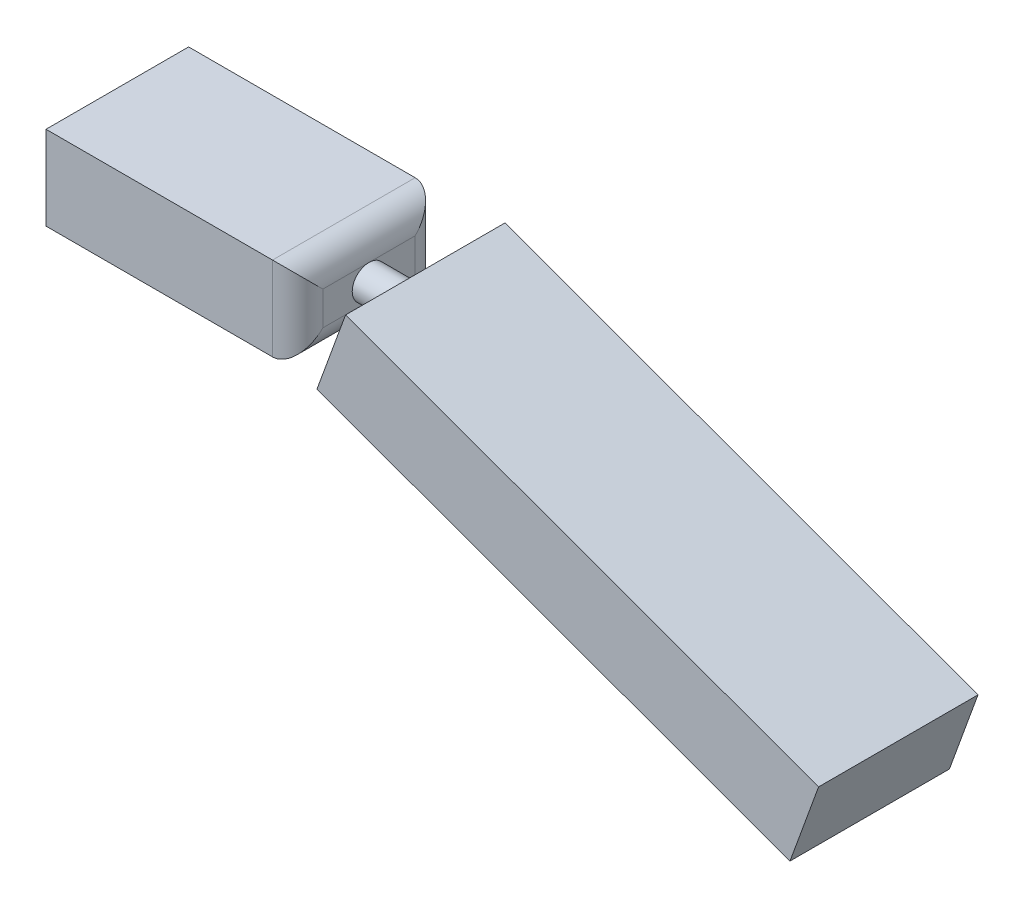
ISO-10303-21;
HEADER;
FILE_DESCRIPTION(('STEP AP214'),'2;1');
FILE_NAME('part.step','',(''),(''),'','','');
FILE_SCHEMA(('AUTOMOTIVE_DESIGN { 1 0 10303 214 1 1 1 1 }'));
ENDSEC;
DATA;
#1=APPLICATION_CONTEXT('core data for automotive mechanical design processes');
#2=APPLICATION_PROTOCOL_DEFINITION('international standard','automotive_design',2000,#1);
#3=PRODUCT_CONTEXT('',#1,'mechanical');
#4=PRODUCT('Part','Part','',(#3));
#5=PRODUCT_RELATED_PRODUCT_CATEGORY('part','',(#4));
#6=PRODUCT_DEFINITION_FORMATION('','',#4);
#7=PRODUCT_DEFINITION_CONTEXT('part definition',#1,'design');
#8=PRODUCT_DEFINITION('design','',#6,#7);
#9=PRODUCT_DEFINITION_SHAPE('','',#8);
#10=(LENGTH_UNIT() NAMED_UNIT(*) SI_UNIT(.MILLI.,.METRE.));
#11=(NAMED_UNIT(*) PLANE_ANGLE_UNIT() SI_UNIT($,.RADIAN.));
#12=(NAMED_UNIT(*) SI_UNIT($,.STERADIAN.) SOLID_ANGLE_UNIT());
#13=UNCERTAINTY_MEASURE_WITH_UNIT(LENGTH_MEASURE(1.E-05),#10,'distance_accuracy_value','');
#14=(GEOMETRIC_REPRESENTATION_CONTEXT(3) GLOBAL_UNCERTAINTY_ASSIGNED_CONTEXT((#13)) GLOBAL_UNIT_ASSIGNED_CONTEXT((#10,
#11,#12)) REPRESENTATION_CONTEXT('',''));
#15=CARTESIAN_POINT('',(0.,0.,0.));
#16=DIRECTION('',(0.,0.,1.));
#17=DIRECTION('',(1.,0.,0.));
#18=AXIS2_PLACEMENT_3D('',#15,#16,#17);
#19=CARTESIAN_POINT('',(35.,5.,-8.5));
#20=DIRECTION('',(-1.,0.,0.));
#21=DIRECTION('',(0.,0.,1.));
#22=AXIS2_PLACEMENT_3D('',#19,#20,#21);
#23=CYLINDRICAL_SURFACE('',#22,2.);
#24=CARTESIAN_POINT('',(30.,5.,-8.5));
#25=DIRECTION('',(1.,0.,0.));
#26=DIRECTION('',(0.,0.,-1.));
#27=AXIS2_PLACEMENT_3D('',#24,#25,#26);
#28=CIRCLE('',#27,2.);
#29=CARTESIAN_POINT('',(30.,7.,-8.5));
#30=VERTEX_POINT('',#29);
#31=CARTESIAN_POINT('',(30.,3.,-8.5));
#32=VERTEX_POINT('',#31);
#33=EDGE_CURVE('E56',#30,#32,#28,.T.);
#34=ORIENTED_EDGE('',*,*,#33,.T.);
#35=EDGE_CURVE('E189',#32,#30,#28,.T.);
#36=ORIENTED_EDGE('',*,*,#35,.T.);
#37=EDGE_LOOP('',(#34,#36));
#38=FACE_BOUND('',#37,.T.);
#39=CARTESIAN_POINT('',(35.,5.,-8.5));
#40=DIRECTION('',(0.939692620785911,-0.342020143325663,0.));
#41=DIRECTION('',(-0.342020143325663,-0.939692620785911,0.));
#42=AXIS2_PLACEMENT_3D('',#39,#40,#41);
#43=ELLIPSE('',#42,2.12835554495182,2.);
#44=CARTESIAN_POINT('',(35.,5.,-6.5));
#45=VERTEX_POINT('',#44);
#46=CARTESIAN_POINT('',(35.,5.,-10.5));
#47=VERTEX_POINT('',#46);
#48=EDGE_CURVE('E49',#45,#47,#43,.T.);
#49=ORIENTED_EDGE('',*,*,#48,.F.);
#50=CARTESIAN_POINT('',(35.,5.,-8.5));
#51=DIRECTION('',(1.,0.,0.));
#52=DIRECTION('',(0.,0.,-1.));
#53=AXIS2_PLACEMENT_3D('',#50,#51,#52);
#54=CIRCLE('',#53,2.);
#55=EDGE_CURVE('E190',#47,#45,#54,.T.);
#56=ORIENTED_EDGE('',*,*,#55,.F.);
#57=EDGE_LOOP('',(#49,#56));
#58=FACE_BOUND('',#57,.T.);
#59=ADVANCED_FACE('F35',(#38,#58),#23,.T.);
#60=CARTESIAN_POINT('',(35.,5.,-8.5));
#61=DIRECTION('',(1.,0.,0.));
#62=DIRECTION('',(0.,0.,-1.));
#63=AXIS2_PLACEMENT_3D('',#60,#61,#62);
#64=PLANE('',#63);
#65=ORIENTED_EDGE('',*,*,#55,.T.);
#66=DIRECTION('',(0.,0.,-1.));
#67=VECTOR('',#66,1.);
#68=CARTESIAN_POINT('',(35.,5.,-8.5));
#69=LINE('',#68,#67);
#70=EDGE_CURVE('E11',#45,#47,#69,.T.);
#71=ORIENTED_EDGE('',*,*,#70,.T.);
#72=EDGE_LOOP('',(#65,#71));
#73=FACE_BOUND('',#72,.T.);
#74=ADVANCED_FACE('F320',(#73),#64,.T.);
#75=CARTESIAN_POINT('',(30.,10.,0.));
#76=DIRECTION('',(-1.,0.,0.));
#77=DIRECTION('',(0.,0.,1.));
#78=AXIS2_PLACEMENT_3D('',#75,#76,#77);
#79=PLANE('',#78);
#80=ORIENTED_EDGE('',*,*,#35,.F.);
#81=DIRECTION('',(0.,0.,-1.));
#82=VECTOR('',#81,1.);
#83=CARTESIAN_POINT('',(30.,3.,-17.));
#84=LINE('',#83,#82);
#85=CARTESIAN_POINT('',(30.,3.,-14.));
#86=VERTEX_POINT('',#85);
#87=EDGE_CURVE('E250',#32,#86,#84,.T.);
#88=ORIENTED_EDGE('',*,*,#87,.T.);
#89=DIRECTION('',(0.,-1.,0.));
#90=VECTOR('',#89,1.);
#91=CARTESIAN_POINT('',(30.,10.,-14.));
#92=LINE('',#91,#90);
#93=CARTESIAN_POINT('',(30.,7.,-14.));
#94=VERTEX_POINT('',#93);
#95=EDGE_CURVE('E253',#86,#94,#92,.F.);
#96=ORIENTED_EDGE('',*,*,#95,.T.);
#97=DIRECTION('',(0.,0.,-1.));
#98=VECTOR('',#97,1.);
#99=CARTESIAN_POINT('',(30.,7.,0.));
#100=LINE('',#99,#98);
#101=EDGE_CURVE('E256',#94,#30,#100,.F.);
#102=ORIENTED_EDGE('',*,*,#101,.T.);
#103=EDGE_LOOP('',(#80,#88,#96,#102));
#104=FACE_BOUND('',#103,.T.);
#105=ADVANCED_FACE('F316',(#104),#79,.F.);
#106=CARTESIAN_POINT('',(0.,10.,0.));
#107=DIRECTION('',(1.,0.,0.));
#108=DIRECTION('',(0.,0.,-1.));
#109=AXIS2_PLACEMENT_3D('',#106,#107,#108);
#110=PLANE('',#109);
#111=DIRECTION('',(0.,-1.,0.));
#112=VECTOR('',#111,1.);
#113=CARTESIAN_POINT('',(0.,1.5,-15.5));
#114=LINE('',#113,#112);
#115=CARTESIAN_POINT('',(0.,8.5,-15.5));
#116=VERTEX_POINT('',#115);
#117=CARTESIAN_POINT('',(0.,1.5,-15.5));
#118=VERTEX_POINT('',#117);
#119=EDGE_CURVE('E211',#116,#118,#114,.T.);
#120=ORIENTED_EDGE('',*,*,#119,.F.);
#121=DIRECTION('',(0.,0.,-1.));
#122=VECTOR('',#121,1.);
#123=CARTESIAN_POINT('',(0.,8.5,-15.5));
#124=LINE('',#123,#122);
#125=CARTESIAN_POINT('',(0.,8.5,-1.5));
#126=VERTEX_POINT('',#125);
#127=EDGE_CURVE('E209',#126,#116,#124,.T.);
#128=ORIENTED_EDGE('',*,*,#127,.F.);
#129=DIRECTION('',(0.,1.,0.));
#130=VECTOR('',#129,1.);
#131=CARTESIAN_POINT('',(0.,8.5,-1.5));
#132=LINE('',#131,#130);
#133=CARTESIAN_POINT('',(0.,1.5,-1.5));
#134=VERTEX_POINT('',#133);
#135=EDGE_CURVE('E199',#134,#126,#132,.T.);
#136=ORIENTED_EDGE('',*,*,#135,.F.);
#137=DIRECTION('',(0.,0.,1.));
#138=VECTOR('',#137,1.);
#139=CARTESIAN_POINT('',(0.,1.5,-15.5));
#140=LINE('',#139,#138);
#141=EDGE_CURVE('E215',#118,#134,#140,.T.);
#142=ORIENTED_EDGE('',*,*,#141,.F.);
#143=EDGE_LOOP('',(#120,#128,#136,#142));
#144=FACE_BOUND('',#143,.T.);
#145=DIRECTION('',(0.,0.,1.));
#146=VECTOR('',#145,1.);
#147=CARTESIAN_POINT('',(0.,0.,0.));
#148=LINE('',#147,#146);
#149=CARTESIAN_POINT('',(0.,0.,-17.));
#150=VERTEX_POINT('',#149);
#151=CARTESIAN_POINT('',(0.,0.,0.));
#152=VERTEX_POINT('',#151);
#153=EDGE_CURVE('E222',#150,#152,#148,.T.);
#154=ORIENTED_EDGE('',*,*,#153,.T.);
#155=DIRECTION('',(0.,-1.,0.));
#156=VECTOR('',#155,1.);
#157=CARTESIAN_POINT('',(0.,10.,0.));
#158=LINE('',#157,#156);
#159=CARTESIAN_POINT('',(0.,10.,0.));
#160=VERTEX_POINT('',#159);
#161=EDGE_CURVE('E247',#160,#152,#158,.T.);
#162=ORIENTED_EDGE('',*,*,#161,.F.);
#163=DIRECTION('',(0.,0.,1.));
#164=VECTOR('',#163,1.);
#165=CARTESIAN_POINT('',(0.,10.,0.));
#166=LINE('',#165,#164);
#167=CARTESIAN_POINT('',(0.,10.,-17.));
#168=VERTEX_POINT('',#167);
#169=EDGE_CURVE('E229',#168,#160,#166,.T.);
#170=ORIENTED_EDGE('',*,*,#169,.F.);
#171=DIRECTION('',(0.,-1.,0.));
#172=VECTOR('',#171,1.);
#173=CARTESIAN_POINT('',(0.,10.,-17.));
#174=LINE('',#173,#172);
#175=EDGE_CURVE('E238',#168,#150,#174,.T.);
#176=ORIENTED_EDGE('',*,*,#175,.T.);
#177=EDGE_LOOP('',(#154,#162,#170,#176));
#178=FACE_BOUND('',#177,.T.);
#179=ADVANCED_FACE('F297',(#144,#178),#110,.F.);
#180=CARTESIAN_POINT('',(0.,10.,0.));
#181=DIRECTION('',(0.,0.,-1.));
#182=DIRECTION('',(-1.,0.,0.));
#183=AXIS2_PLACEMENT_3D('',#180,#181,#182);
#184=PLANE('',#183);
#185=DIRECTION('',(1.,0.,0.));
#186=VECTOR('',#185,1.);
#187=CARTESIAN_POINT('',(0.,0.,0.));
#188=LINE('',#187,#186);
#189=CARTESIAN_POINT('',(27.,0.,0.));
#190=VERTEX_POINT('',#189);
#191=EDGE_CURVE('E241',#152,#190,#188,.T.);
#192=ORIENTED_EDGE('',*,*,#191,.T.);
#193=DIRECTION('',(0.,-1.,0.));
#194=VECTOR('',#193,1.);
#195=CARTESIAN_POINT('',(27.,10.,0.));
#196=LINE('',#195,#194);
#197=CARTESIAN_POINT('',(27.,10.,0.));
#198=VERTEX_POINT('',#197);
#199=EDGE_CURVE('E262',#190,#198,#196,.F.);
#200=ORIENTED_EDGE('',*,*,#199,.T.);
#201=DIRECTION('',(1.,0.,0.));
#202=VECTOR('',#201,1.);
#203=CARTESIAN_POINT('',(0.,10.,0.));
#204=LINE('',#203,#202);
#205=EDGE_CURVE('E232',#160,#198,#204,.T.);
#206=ORIENTED_EDGE('',*,*,#205,.F.);
#207=ORIENTED_EDGE('',*,*,#161,.T.);
#208=EDGE_LOOP('',(#192,#200,#206,#207));
#209=FACE_BOUND('',#208,.T.);
#210=ADVANCED_FACE('F302',(#209),#184,.F.);
#211=ORIENTED_EDGE('',*,*,#33,.F.);
#212=CARTESIAN_POINT('',(30.,7.,-3.));
#213=VERTEX_POINT('',#212);
#214=EDGE_CURVE('E255',#30,#213,#100,.F.);
#215=ORIENTED_EDGE('',*,*,#214,.T.);
#216=DIRECTION('',(0.,-1.,0.));
#217=VECTOR('',#216,1.);
#218=CARTESIAN_POINT('',(30.,10.,-3.));
#219=LINE('',#218,#217);
#220=CARTESIAN_POINT('',(30.,3.,-3.));
#221=VERTEX_POINT('',#220);
#222=EDGE_CURVE('E259',#213,#221,#219,.T.);
#223=ORIENTED_EDGE('',*,*,#222,.T.);
#224=EDGE_CURVE('E251',#221,#32,#84,.T.);
#225=ORIENTED_EDGE('',*,*,#224,.T.);
#226=EDGE_LOOP('',(#211,#215,#223,#225));
#227=FACE_BOUND('',#226,.T.);
#228=ADVANCED_FACE('F313',(#227),#79,.F.);
#229=CARTESIAN_POINT('',(0.,10.,-17.));
#230=DIRECTION('',(0.,0.,1.));
#231=DIRECTION('',(1.,0.,0.));
#232=AXIS2_PLACEMENT_3D('',#229,#230,#231);
#233=PLANE('',#232);
#234=DIRECTION('',(-1.,0.,0.));
#235=VECTOR('',#234,1.);
#236=CARTESIAN_POINT('',(0.,10.,-17.));
#237=LINE('',#236,#235);
#238=CARTESIAN_POINT('',(27.,10.,-17.));
#239=VERTEX_POINT('',#238);
#240=EDGE_CURVE('E236',#239,#168,#237,.T.);
#241=ORIENTED_EDGE('',*,*,#240,.F.);
#242=DIRECTION('',(0.,-1.,0.));
#243=VECTOR('',#242,1.);
#244=CARTESIAN_POINT('',(27.,10.,-17.));
#245=LINE('',#244,#243);
#246=CARTESIAN_POINT('',(27.,0.,-17.));
#247=VERTEX_POINT('',#246);
#248=EDGE_CURVE('E267',#239,#247,#245,.T.);
#249=ORIENTED_EDGE('',*,*,#248,.T.);
#250=DIRECTION('',(-1.,0.,0.));
#251=VECTOR('',#250,1.);
#252=CARTESIAN_POINT('',(0.,0.,-17.));
#253=LINE('',#252,#251);
#254=EDGE_CURVE('E233',#247,#150,#253,.T.);
#255=ORIENTED_EDGE('',*,*,#254,.T.);
#256=ORIENTED_EDGE('',*,*,#175,.F.);
#257=EDGE_LOOP('',(#241,#249,#255,#256));
#258=FACE_BOUND('',#257,.T.);
#259=ADVANCED_FACE('F290',(#258),#233,.F.);
#260=CARTESIAN_POINT('',(0.,10.,0.));
#261=DIRECTION('',(0.,-1.,0.));
#262=DIRECTION('',(0.,0.,-1.));
#263=AXIS2_PLACEMENT_3D('',#260,#261,#262);
#264=PLANE('',#263);
#265=ORIENTED_EDGE('',*,*,#205,.T.);
#266=DIRECTION('',(0.,0.,-1.));
#267=VECTOR('',#266,1.);
#268=CARTESIAN_POINT('',(27.,10.,0.));
#269=LINE('',#268,#267);
#270=EDGE_CURVE('E265',#198,#239,#269,.T.);
#271=ORIENTED_EDGE('',*,*,#270,.T.);
#272=ORIENTED_EDGE('',*,*,#240,.T.);
#273=ORIENTED_EDGE('',*,*,#169,.T.);
#274=EDGE_LOOP('',(#265,#271,#272,#273));
#275=FACE_BOUND('',#274,.T.);
#276=ADVANCED_FACE('F300',(#275),#264,.F.);
#277=CARTESIAN_POINT('',(0.,0.,0.));
#278=DIRECTION('',(0.,-1.,0.));
#279=DIRECTION('',(0.,0.,-1.));
#280=AXIS2_PLACEMENT_3D('',#277,#278,#279);
#281=PLANE('',#280);
#282=ORIENTED_EDGE('',*,*,#254,.F.);
#283=DIRECTION('',(0.,0.,-1.));
#284=VECTOR('',#283,1.);
#285=CARTESIAN_POINT('',(27.,0.,0.));
#286=LINE('',#285,#284);
#287=EDGE_CURVE('E43',#247,#190,#286,.F.);
#288=ORIENTED_EDGE('',*,*,#287,.T.);
#289=ORIENTED_EDGE('',*,*,#191,.F.);
#290=ORIENTED_EDGE('',*,*,#153,.F.);
#291=EDGE_LOOP('',(#282,#288,#289,#290));
#292=FACE_BOUND('',#291,.T.);
#293=ADVANCED_FACE('F294',(#292),#281,.T.);
#294=CARTESIAN_POINT('',(12.,8.5,-15.5));
#295=DIRECTION('',(0.,1.,0.));
#296=DIRECTION('',(0.,0.,1.));
#297=AXIS2_PLACEMENT_3D('',#294,#295,#296);
#298=PLANE('',#297);
#299=ORIENTED_EDGE('',*,*,#127,.T.);
#300=DIRECTION('',(-1.,0.,0.));
#301=VECTOR('',#300,1.);
#302=CARTESIAN_POINT('',(12.,8.5,-15.5));
#303=LINE('',#302,#301);
#304=CARTESIAN_POINT('',(12.,8.5,-15.5));
#305=VERTEX_POINT('',#304);
#306=EDGE_CURVE('E208',#305,#116,#303,.T.);
#307=ORIENTED_EDGE('',*,*,#306,.F.);
#308=DIRECTION('',(0.,0.,-1.));
#309=VECTOR('',#308,1.);
#310=CARTESIAN_POINT('',(12.,8.5,-15.5));
#311=LINE('',#310,#309);
#312=CARTESIAN_POINT('',(12.,8.5,-1.5));
#313=VERTEX_POINT('',#312);
#314=EDGE_CURVE('E195',#313,#305,#311,.T.);
#315=ORIENTED_EDGE('',*,*,#314,.F.);
#316=DIRECTION('',(-1.,0.,0.));
#317=VECTOR('',#316,1.);
#318=CARTESIAN_POINT('',(12.,8.5,-1.5));
#319=LINE('',#318,#317);
#320=EDGE_CURVE('E220',#313,#126,#319,.T.);
#321=ORIENTED_EDGE('',*,*,#320,.T.);
#322=EDGE_LOOP('',(#299,#307,#315,#321));
#323=FACE_BOUND('',#322,.T.);
#324=ADVANCED_FACE('F355',(#323),#298,.F.);
#325=CARTESIAN_POINT('',(12.,8.5,-1.5));
#326=DIRECTION('',(0.,0.,1.));
#327=DIRECTION('',(1.,0.,0.));
#328=AXIS2_PLACEMENT_3D('',#325,#326,#327);
#329=PLANE('',#328);
#330=ORIENTED_EDGE('',*,*,#135,.T.);
#331=ORIENTED_EDGE('',*,*,#320,.F.);
#332=DIRECTION('',(0.,1.,0.));
#333=VECTOR('',#332,1.);
#334=CARTESIAN_POINT('',(12.,8.5,-1.5));
#335=LINE('',#334,#333);
#336=CARTESIAN_POINT('',(12.,1.5,-1.5));
#337=VERTEX_POINT('',#336);
#338=EDGE_CURVE('E205',#337,#313,#335,.T.);
#339=ORIENTED_EDGE('',*,*,#338,.F.);
#340=DIRECTION('',(-1.,0.,0.));
#341=VECTOR('',#340,1.);
#342=CARTESIAN_POINT('',(12.,1.5,-1.5));
#343=LINE('',#342,#341);
#344=EDGE_CURVE('E223',#337,#134,#343,.T.);
#345=ORIENTED_EDGE('',*,*,#344,.T.);
#346=EDGE_LOOP('',(#330,#331,#339,#345));
#347=FACE_BOUND('',#346,.T.);
#348=ADVANCED_FACE('F351',(#347),#329,.F.);
#349=CARTESIAN_POINT('',(12.,1.5,-15.5));
#350=DIRECTION('',(0.,-1.,0.));
#351=DIRECTION('',(0.,0.,-1.));
#352=AXIS2_PLACEMENT_3D('',#349,#350,#351);
#353=PLANE('',#352);
#354=ORIENTED_EDGE('',*,*,#141,.T.);
#355=ORIENTED_EDGE('',*,*,#344,.F.);
#356=DIRECTION('',(0.,0.,1.));
#357=VECTOR('',#356,1.);
#358=CARTESIAN_POINT('',(12.,1.5,-15.5));
#359=LINE('',#358,#357);
#360=CARTESIAN_POINT('',(12.,1.5,-15.5));
#361=VERTEX_POINT('',#360);
#362=EDGE_CURVE('E202',#361,#337,#359,.T.);
#363=ORIENTED_EDGE('',*,*,#362,.F.);
#364=DIRECTION('',(-1.,0.,0.));
#365=VECTOR('',#364,1.);
#366=CARTESIAN_POINT('',(12.,1.5,-15.5));
#367=LINE('',#366,#365);
#368=EDGE_CURVE('E225',#361,#118,#367,.T.);
#369=ORIENTED_EDGE('',*,*,#368,.T.);
#370=EDGE_LOOP('',(#354,#355,#363,#369));
#371=FACE_BOUND('',#370,.T.);
#372=ADVANCED_FACE('F354',(#371),#353,.F.);
#373=CARTESIAN_POINT('',(12.,1.5,-15.5));
#374=DIRECTION('',(0.,0.,-1.));
#375=DIRECTION('',(-1.,0.,0.));
#376=AXIS2_PLACEMENT_3D('',#373,#374,#375);
#377=PLANE('',#376);
#378=ORIENTED_EDGE('',*,*,#119,.T.);
#379=ORIENTED_EDGE('',*,*,#368,.F.);
#380=DIRECTION('',(0.,-1.,0.));
#381=VECTOR('',#380,1.);
#382=CARTESIAN_POINT('',(12.,1.5,-15.5));
#383=LINE('',#382,#381);
#384=EDGE_CURVE('E198',#305,#361,#383,.T.);
#385=ORIENTED_EDGE('',*,*,#384,.F.);
#386=ORIENTED_EDGE('',*,*,#306,.T.);
#387=EDGE_LOOP('',(#378,#379,#385,#386));
#388=FACE_BOUND('',#387,.T.);
#389=ADVANCED_FACE('F349',(#388),#377,.F.);
#390=CARTESIAN_POINT('',(12.,0.,0.));
#391=DIRECTION('',(1.,0.,0.));
#392=DIRECTION('',(0.,0.,-1.));
#393=AXIS2_PLACEMENT_3D('',#390,#391,#392);
#394=PLANE('',#393);
#395=ORIENTED_EDGE('',*,*,#314,.T.);
#396=ORIENTED_EDGE('',*,*,#384,.T.);
#397=ORIENTED_EDGE('',*,*,#362,.T.);
#398=ORIENTED_EDGE('',*,*,#338,.T.);
#399=EDGE_LOOP('',(#395,#396,#397,#398));
#400=FACE_BOUND('',#399,.T.);
#401=ADVANCED_FACE('F346',(#400),#394,.F.);
#402=CARTESIAN_POINT('',(27.,10.,-14.));
#403=DIRECTION('',(0.,-1.,0.));
#404=DIRECTION('',(0.,0.,-1.));
#405=AXIS2_PLACEMENT_3D('',#402,#403,#404);
#406=CYLINDRICAL_SURFACE('',#405,3.);
#407=CARTESIAN_POINT('',(27.,3.,-14.));
#408=DIRECTION('',(0.,-0.707106781186547,0.707106781186547));
#409=DIRECTION('',(0.,0.707106781186547,0.707106781186547));
#410=AXIS2_PLACEMENT_3D('',#407,#408,#409);
#411=ELLIPSE('',#410,4.24264068711928,3.);
#412=EDGE_CURVE('E273',#247,#86,#411,.T.);
#413=ORIENTED_EDGE('',*,*,#412,.F.);
#414=ORIENTED_EDGE('',*,*,#248,.F.);
#415=CARTESIAN_POINT('',(27.,7.,-14.));
#416=DIRECTION('',(0.,-0.707106781186547,-0.707106781186547));
#417=DIRECTION('',(0.,-0.707106781186547,0.707106781186547));
#418=AXIS2_PLACEMENT_3D('',#415,#416,#417);
#419=ELLIPSE('',#418,4.24264068711928,3.);
#420=EDGE_CURVE('E212',#94,#239,#419,.F.);
#421=ORIENTED_EDGE('',*,*,#420,.F.);
#422=ORIENTED_EDGE('',*,*,#95,.F.);
#423=EDGE_LOOP('',(#413,#414,#421,#422));
#424=FACE_BOUND('',#423,.T.);
#425=ADVANCED_FACE('F37',(#424),#406,.T.);
#426=CARTESIAN_POINT('',(27.,7.,0.));
#427=DIRECTION('',(0.,0.,-1.));
#428=DIRECTION('',(-1.,0.,0.));
#429=AXIS2_PLACEMENT_3D('',#426,#427,#428);
#430=CYLINDRICAL_SURFACE('',#429,3.);
#431=ORIENTED_EDGE('',*,*,#420,.T.);
#432=ORIENTED_EDGE('',*,*,#270,.F.);
#433=CARTESIAN_POINT('',(27.,7.,-3.));
#434=DIRECTION('',(0.,0.707106781186547,-0.707106781186547));
#435=DIRECTION('',(0.,-0.707106781186547,-0.707106781186547));
#436=AXIS2_PLACEMENT_3D('',#433,#434,#435);
#437=ELLIPSE('',#436,4.24264068711928,3.);
#438=EDGE_CURVE('E271',#213,#198,#437,.F.);
#439=ORIENTED_EDGE('',*,*,#438,.F.);
#440=ORIENTED_EDGE('',*,*,#214,.F.);
#441=ORIENTED_EDGE('',*,*,#101,.F.);
#442=EDGE_LOOP('',(#431,#432,#439,#440,#441));
#443=FACE_BOUND('',#442,.T.);
#444=ADVANCED_FACE('F280',(#443),#430,.T.);
#445=CARTESIAN_POINT('',(27.,3.,0.));
#446=DIRECTION('',(0.,0.,1.));
#447=DIRECTION('',(1.,0.,0.));
#448=AXIS2_PLACEMENT_3D('',#445,#446,#447);
#449=CYLINDRICAL_SURFACE('',#448,3.);
#450=ORIENTED_EDGE('',*,*,#412,.T.);
#451=ORIENTED_EDGE('',*,*,#87,.F.);
#452=ORIENTED_EDGE('',*,*,#224,.F.);
#453=CARTESIAN_POINT('',(27.,3.,-3.));
#454=DIRECTION('',(0.,0.707106781186547,0.707106781186547));
#455=DIRECTION('',(0.,-0.707106781186547,0.707106781186547));
#456=AXIS2_PLACEMENT_3D('',#453,#454,#455);
#457=ELLIPSE('',#456,4.24264068711928,3.);
#458=EDGE_CURVE('E193',#190,#221,#457,.T.);
#459=ORIENTED_EDGE('',*,*,#458,.F.);
#460=ORIENTED_EDGE('',*,*,#287,.F.);
#461=EDGE_LOOP('',(#450,#451,#452,#459,#460));
#462=FACE_BOUND('',#461,.T.);
#463=ADVANCED_FACE('F310',(#462),#449,.T.);
#464=CARTESIAN_POINT('',(27.,10.,-3.));
#465=DIRECTION('',(0.,-1.,0.));
#466=DIRECTION('',(0.,0.,-1.));
#467=AXIS2_PLACEMENT_3D('',#464,#465,#466);
#468=CYLINDRICAL_SURFACE('',#467,3.);
#469=ORIENTED_EDGE('',*,*,#438,.T.);
#470=ORIENTED_EDGE('',*,*,#199,.F.);
#471=ORIENTED_EDGE('',*,*,#458,.T.);
#472=ORIENTED_EDGE('',*,*,#222,.F.);
#473=EDGE_LOOP('',(#469,#470,#471,#472));
#474=FACE_BOUND('',#473,.T.);
#475=ADVANCED_FACE('F306',(#474),#468,.T.);
#476=CARTESIAN_POINT('',(36.7045308884095,9.68316012666826,1.));
#477=DIRECTION('',(0.939692620785911,-0.342020143325663,0.));
#478=DIRECTION('',(0.342020143325663,0.939692620785911,0.));
#479=AXIS2_PLACEMENT_3D('',#476,#477,#478);
#480=PLANE('',#479);
#481=DIRECTION('',(0.,0.,-1.));
#482=VECTOR('',#481,1.);
#483=CARTESIAN_POINT('',(36.7045308884095,9.68316012666826,1.));
#484=LINE('',#483,#482);
#485=CARTESIAN_POINT('',(36.7045308884095,9.68316012666826,1.));
#486=VERTEX_POINT('',#485);
#487=CARTESIAN_POINT('',(36.7045308884095,9.68316012666826,-18.));
#488=VERTEX_POINT('',#487);
#489=EDGE_CURVE('E185',#486,#488,#484,.T.);
#490=ORIENTED_EDGE('',*,*,#489,.T.);
#491=DIRECTION('',(-0.342020143325663,-0.939692620785911,0.));
#492=VECTOR('',#491,1.);
#493=CARTESIAN_POINT('',(36.7045308884095,9.68316012666826,-18.));
#494=LINE('',#493,#492);
#495=CARTESIAN_POINT('',(33.2954691115904,0.316839873331753,-18.));
#496=VERTEX_POINT('',#495);
#497=EDGE_CURVE('E175',#488,#496,#494,.T.);
#498=ORIENTED_EDGE('',*,*,#497,.T.);
#499=DIRECTION('',(0.,0.,-1.));
#500=VECTOR('',#499,1.);
#501=CARTESIAN_POINT('',(33.2954691115904,0.316839873331753,1.));
#502=LINE('',#501,#500);
#503=CARTESIAN_POINT('',(33.2954691115904,0.316839873331753,1.));
#504=VERTEX_POINT('',#503);
#505=EDGE_CURVE('E171',#504,#496,#502,.T.);
#506=ORIENTED_EDGE('',*,*,#505,.F.);
#507=DIRECTION('',(-0.342020143325663,-0.939692620785911,0.));
#508=VECTOR('',#507,1.);
#509=CARTESIAN_POINT('',(36.7045308884095,9.68316012666826,1.));
#510=LINE('',#509,#508);
#511=EDGE_CURVE('E182',#486,#504,#510,.T.);
#512=ORIENTED_EDGE('',*,*,#511,.F.);
#513=EDGE_LOOP('',(#490,#498,#506,#512));
#514=FACE_BOUND('',#513,.T.);
#515=ORIENTED_EDGE('',*,*,#70,.F.);
#516=ORIENTED_EDGE('',*,*,#48,.T.);
#517=EDGE_LOOP('',(#515,#516));
#518=FACE_BOUND('',#517,.T.);
#519=ADVANCED_FACE('F324',(#514,#518),#480,.F.);
#520=CARTESIAN_POINT('',(33.2954691115904,0.316839873331753,1.));
#521=DIRECTION('',(0.342020143325663,0.939692620785911,0.));
#522=DIRECTION('',(-0.939692620785911,0.342020143325663,0.));
#523=AXIS2_PLACEMENT_3D('',#520,#521,#522);
#524=PLANE('',#523);
#525=ORIENTED_EDGE('',*,*,#505,.T.);
#526=DIRECTION('',(0.939692620785911,-0.342020143325663,0.));
#527=VECTOR('',#526,1.);
#528=CARTESIAN_POINT('',(33.2954691115904,0.316839873331753,-18.));
#529=LINE('',#528,#527);
#530=CARTESIAN_POINT('',(89.6770263587451,-20.204368726208,-18.));
#531=VERTEX_POINT('',#530);
#532=EDGE_CURVE('E164',#496,#531,#529,.T.);
#533=ORIENTED_EDGE('',*,*,#532,.T.);
#534=DIRECTION('',(0.,0.,-1.));
#535=VECTOR('',#534,1.);
#536=CARTESIAN_POINT('',(89.6770263587451,-20.204368726208,1.));
#537=LINE('',#536,#535);
#538=CARTESIAN_POINT('',(89.6770263587451,-20.204368726208,1.));
#539=VERTEX_POINT('',#538);
#540=EDGE_CURVE('E147',#539,#531,#537,.T.);
#541=ORIENTED_EDGE('',*,*,#540,.F.);
#542=DIRECTION('',(0.939692620785911,-0.342020143325663,0.));
#543=VECTOR('',#542,1.);
#544=CARTESIAN_POINT('',(33.2954691115904,0.316839873331753,1.));
#545=LINE('',#544,#543);
#546=EDGE_CURVE('E177',#504,#539,#545,.T.);
#547=ORIENTED_EDGE('',*,*,#546,.F.);
#548=EDGE_LOOP('',(#525,#533,#541,#547));
#549=FACE_BOUND('',#548,.T.);
#550=ADVANCED_FACE('F169',(#549),#524,.F.);
#551=CARTESIAN_POINT('',(89.6770263587451,-20.204368726208,1.));
#552=DIRECTION('',(-0.939692620785911,0.342020143325662,0.));
#553=DIRECTION('',(-0.342020143325662,-0.939692620785911,0.));
#554=AXIS2_PLACEMENT_3D('',#551,#552,#553);
#555=PLANE('',#554);
#556=ORIENTED_EDGE('',*,*,#540,.T.);
#557=DIRECTION('',(0.342020143325662,0.939692620785911,0.));
#558=VECTOR('',#557,1.);
#559=CARTESIAN_POINT('',(89.6770263587451,-20.204368726208,-18.));
#560=LINE('',#559,#558);
#561=CARTESIAN_POINT('',(93.0860881355642,-10.8380484728715,-18.));
#562=VERTEX_POINT('',#561);
#563=EDGE_CURVE('E151',#531,#562,#560,.T.);
#564=ORIENTED_EDGE('',*,*,#563,.T.);
#565=DIRECTION('',(0.,0.,-1.));
#566=VECTOR('',#565,1.);
#567=CARTESIAN_POINT('',(93.0860881355642,-10.8380484728715,1.));
#568=LINE('',#567,#566);
#569=CARTESIAN_POINT('',(93.0860881355642,-10.8380484728715,1.));
#570=VERTEX_POINT('',#569);
#571=EDGE_CURVE('E157',#570,#562,#568,.T.);
#572=ORIENTED_EDGE('',*,*,#571,.F.);
#573=DIRECTION('',(0.342020143325662,0.939692620785911,0.));
#574=VECTOR('',#573,1.);
#575=CARTESIAN_POINT('',(89.6770263587451,-20.204368726208,1.));
#576=LINE('',#575,#574);
#577=EDGE_CURVE('E152',#539,#570,#576,.T.);
#578=ORIENTED_EDGE('',*,*,#577,.F.);
#579=EDGE_LOOP('',(#556,#564,#572,#578));
#580=FACE_BOUND('',#579,.T.);
#581=ADVANCED_FACE('F149',(#580),#555,.F.);
#582=CARTESIAN_POINT('',(36.7045308884095,9.68316012666826,1.));
#583=DIRECTION('',(-0.342020143325663,-0.939692620785911,0.));
#584=DIRECTION('',(0.939692620785911,-0.342020143325663,0.));
#585=AXIS2_PLACEMENT_3D('',#582,#583,#584);
#586=PLANE('',#585);
#587=ORIENTED_EDGE('',*,*,#571,.T.);
#588=DIRECTION('',(-0.939692620785911,0.342020143325663,0.));
#589=VECTOR('',#588,1.);
#590=CARTESIAN_POINT('',(36.7045308884095,9.68316012666826,-18.));
#591=LINE('',#590,#589);
#592=EDGE_CURVE('E167',#562,#488,#591,.T.);
#593=ORIENTED_EDGE('',*,*,#592,.T.);
#594=ORIENTED_EDGE('',*,*,#489,.F.);
#595=DIRECTION('',(-0.939692620785911,0.342020143325663,0.));
#596=VECTOR('',#595,1.);
#597=CARTESIAN_POINT('',(36.7045308884095,9.68316012666826,1.));
#598=LINE('',#597,#596);
#599=EDGE_CURVE('E180',#570,#486,#598,.T.);
#600=ORIENTED_EDGE('',*,*,#599,.F.);
#601=EDGE_LOOP('',(#587,#593,#594,#600));
#602=FACE_BOUND('',#601,.T.);
#603=ADVANCED_FACE('F338',(#602),#586,.F.);
#604=CARTESIAN_POINT('',(0.,0.,1.));
#605=DIRECTION('',(0.,0.,1.));
#606=DIRECTION('',(1.,0.,0.));
#607=AXIS2_PLACEMENT_3D('',#604,#605,#606);
#608=PLANE('',#607);
#609=ORIENTED_EDGE('',*,*,#546,.T.);
#610=ORIENTED_EDGE('',*,*,#577,.T.);
#611=ORIENTED_EDGE('',*,*,#599,.T.);
#612=ORIENTED_EDGE('',*,*,#511,.T.);
#613=EDGE_LOOP('',(#609,#610,#611,#612));
#614=FACE_BOUND('',#613,.T.);
#615=ADVANCED_FACE('F336',(#614),#608,.T.);
#616=CARTESIAN_POINT('',(0.,0.,-18.));
#617=DIRECTION('',(0.,0.,1.));
#618=DIRECTION('',(1.,0.,0.));
#619=AXIS2_PLACEMENT_3D('',#616,#617,#618);
#620=PLANE('',#619);
#621=ORIENTED_EDGE('',*,*,#532,.F.);
#622=ORIENTED_EDGE('',*,*,#497,.F.);
#623=ORIENTED_EDGE('',*,*,#592,.F.);
#624=ORIENTED_EDGE('',*,*,#563,.F.);
#625=EDGE_LOOP('',(#621,#622,#623,#624));
#626=FACE_BOUND('',#625,.T.);
#627=ADVANCED_FACE('F162',(#626),#620,.F.);
#628=CLOSED_SHELL('',(#59,#74,#105,#179,#210,#228,#259,#276,#293,#324,#348,#372,#389,#401,#425,
#444,#463,#475,#519,#550,#581,#603,#615,#627));
#629=MANIFOLD_SOLID_BREP('B2',#628);
#630=ADVANCED_BREP_SHAPE_REPRESENTATION('',(#18,#629),#14);
#631=SHAPE_DEFINITION_REPRESENTATION(#9,#630);
ENDSEC;
END-ISO-10303-21;
